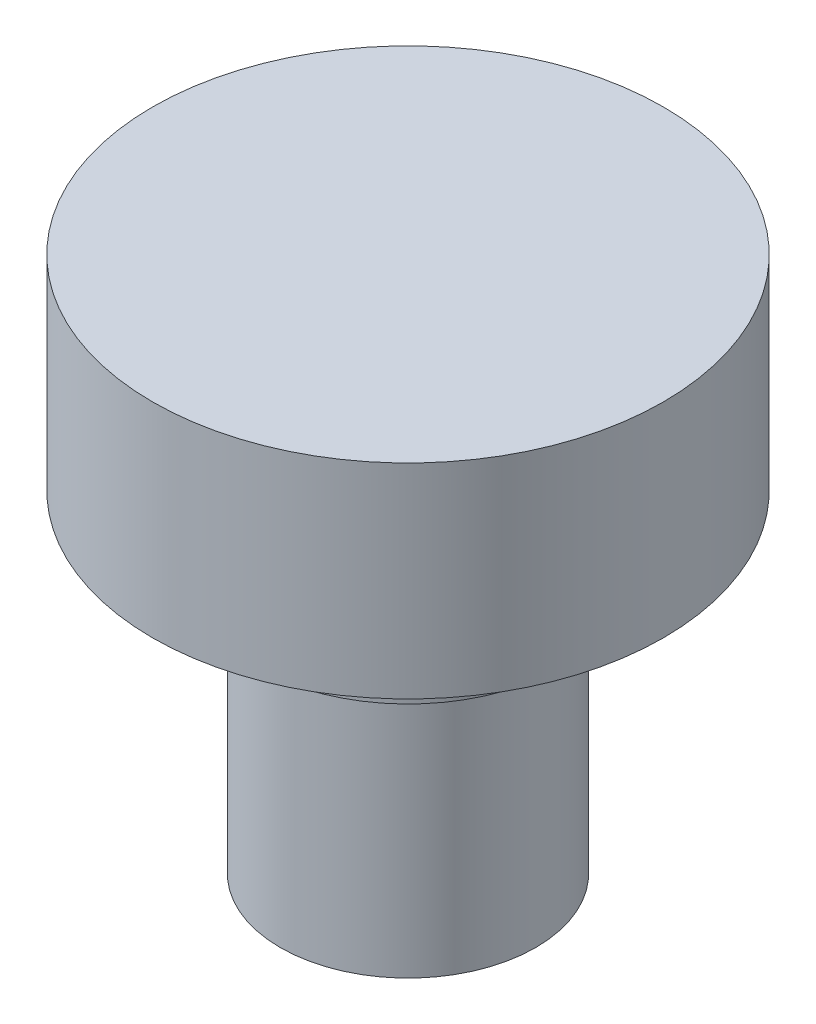
ISO-10303-21;
HEADER;
FILE_DESCRIPTION(('STEP AP214'),'2;1');
FILE_NAME('part.step','',(''),(''),'','','');
FILE_SCHEMA(('AUTOMOTIVE_DESIGN { 1 0 10303 214 1 1 1 1 }'));
ENDSEC;
DATA;
#1=APPLICATION_CONTEXT('core data for automotive mechanical design processes');
#2=APPLICATION_PROTOCOL_DEFINITION('international standard','automotive_design',2000,#1);
#3=PRODUCT_CONTEXT('',#1,'mechanical');
#4=PRODUCT('Part','Part','',(#3));
#5=PRODUCT_RELATED_PRODUCT_CATEGORY('part','',(#4));
#6=PRODUCT_DEFINITION_FORMATION('','',#4);
#7=PRODUCT_DEFINITION_CONTEXT('part definition',#1,'design');
#8=PRODUCT_DEFINITION('design','',#6,#7);
#9=PRODUCT_DEFINITION_SHAPE('','',#8);
#10=(LENGTH_UNIT() NAMED_UNIT(*) SI_UNIT(.MILLI.,.METRE.));
#11=(NAMED_UNIT(*) PLANE_ANGLE_UNIT() SI_UNIT($,.RADIAN.));
#12=(NAMED_UNIT(*) SI_UNIT($,.STERADIAN.) SOLID_ANGLE_UNIT());
#13=UNCERTAINTY_MEASURE_WITH_UNIT(LENGTH_MEASURE(1.E-05),#10,'distance_accuracy_value','');
#14=(GEOMETRIC_REPRESENTATION_CONTEXT(3) GLOBAL_UNCERTAINTY_ASSIGNED_CONTEXT((#13)) GLOBAL_UNIT_ASSIGNED_CONTEXT((#10,
#11,#12)) REPRESENTATION_CONTEXT('',''));
#15=CARTESIAN_POINT('',(0.,0.,0.));
#16=DIRECTION('',(0.,0.,1.));
#17=DIRECTION('',(1.,0.,0.));
#18=AXIS2_PLACEMENT_3D('',#15,#16,#17);
#19=CARTESIAN_POINT('',(0.,4.,0.));
#20=DIRECTION('',(0.,-1.,0.));
#21=DIRECTION('',(0.,0.,-1.));
#22=AXIS2_PLACEMENT_3D('',#19,#20,#21);
#23=CYLINDRICAL_SURFACE('',#22,5.);
#24=CARTESIAN_POINT('',(0.,4.,0.));
#25=DIRECTION('',(0.,1.,0.));
#26=DIRECTION('',(0.,0.,1.));
#27=AXIS2_PLACEMENT_3D('',#24,#25,#26);
#28=CIRCLE('',#27,5.);
#29=CARTESIAN_POINT('',(0.,4.,5.));
#30=VERTEX_POINT('',#29);
#31=EDGE_CURVE('E46',#30,#30,#28,.T.);
#32=ORIENTED_EDGE('',*,*,#31,.F.);
#33=EDGE_LOOP('',(#32));
#34=FACE_BOUND('',#33,.T.);
#35=CARTESIAN_POINT('',(0.,0.,0.));
#36=DIRECTION('',(0.,1.,0.));
#37=DIRECTION('',(0.,0.,1.));
#38=AXIS2_PLACEMENT_3D('',#35,#36,#37);
#39=CIRCLE('',#38,5.);
#40=CARTESIAN_POINT('',(0.,0.,5.));
#41=VERTEX_POINT('',#40);
#42=EDGE_CURVE('E75',#41,#41,#39,.T.);
#43=ORIENTED_EDGE('',*,*,#42,.T.);
#44=EDGE_LOOP('',(#43));
#45=FACE_BOUND('',#44,.T.);
#46=ADVANCED_FACE('F39',(#34,#45),#23,.T.);
#47=CARTESIAN_POINT('',(0.,4.,0.));
#48=DIRECTION('',(0.,1.,0.));
#49=DIRECTION('',(0.,0.,1.));
#50=AXIS2_PLACEMENT_3D('',#47,#48,#49);
#51=PLANE('',#50);
#52=ORIENTED_EDGE('',*,*,#31,.T.);
#53=EDGE_LOOP('',(#52));
#54=FACE_BOUND('',#53,.T.);
#55=ADVANCED_FACE('F103',(#54),#51,.T.);
#56=CARTESIAN_POINT('',(0.,0.,0.));
#57=DIRECTION('',(0.,1.,0.));
#58=DIRECTION('',(0.,0.,1.));
#59=AXIS2_PLACEMENT_3D('',#56,#57,#58);
#60=PLANE('',#59);
#61=CARTESIAN_POINT('',(0.,0.,0.));
#62=DIRECTION('',(0.,1.,0.));
#63=DIRECTION('',(0.,0.,1.));
#64=AXIS2_PLACEMENT_3D('',#61,#62,#63);
#65=CIRCLE('',#64,3.);
#66=CARTESIAN_POINT('',(0.,0.,3.));
#67=VERTEX_POINT('',#66);
#68=EDGE_CURVE('E11',#67,#67,#65,.F.);
#69=ORIENTED_EDGE('',*,*,#68,.F.);
#70=EDGE_LOOP('',(#69));
#71=FACE_BOUND('',#70,.T.);
#72=ORIENTED_EDGE('',*,*,#42,.F.);
#73=EDGE_LOOP('',(#72));
#74=FACE_BOUND('',#73,.T.);
#75=ADVANCED_FACE('F97',(#71,#74),#60,.F.);
#76=CARTESIAN_POINT('',(0.,-1.5,0.));
#77=DIRECTION('',(0.,1.,0.));
#78=DIRECTION('',(0.,0.,1.));
#79=AXIS2_PLACEMENT_3D('',#76,#77,#78);
#80=CYLINDRICAL_SURFACE('',#79,3.);
#81=CARTESIAN_POINT('',(0.,-1.5,0.));
#82=DIRECTION('',(0.,-1.,0.));
#83=DIRECTION('',(0.,0.,-1.));
#84=AXIS2_PLACEMENT_3D('',#81,#82,#83);
#85=CIRCLE('',#84,3.);
#86=CARTESIAN_POINT('',(0.,-1.5,-3.));
#87=VERTEX_POINT('',#86);
#88=EDGE_CURVE('E60',#87,#87,#85,.T.);
#89=ORIENTED_EDGE('',*,*,#88,.F.);
#90=EDGE_LOOP('',(#89));
#91=FACE_BOUND('',#90,.T.);
#92=ORIENTED_EDGE('',*,*,#68,.T.);
#93=EDGE_LOOP('',(#92));
#94=FACE_BOUND('',#93,.T.);
#95=ADVANCED_FACE('F91',(#91,#94),#80,.T.);
#96=CARTESIAN_POINT('',(0.,-1.5,0.));
#97=DIRECTION('',(0.,-1.,0.));
#98=DIRECTION('',(0.,0.,-1.));
#99=AXIS2_PLACEMENT_3D('',#96,#97,#98);
#100=PLANE('',#99);
#101=CARTESIAN_POINT('',(0.,-1.5,0.));
#102=DIRECTION('',(0.,-1.,0.));
#103=DIRECTION('',(0.,0.,-1.));
#104=AXIS2_PLACEMENT_3D('',#101,#102,#103);
#105=CIRCLE('',#104,2.5);
#106=CARTESIAN_POINT('',(0.,-1.5,2.5));
#107=VERTEX_POINT('',#106);
#108=EDGE_CURVE('E66',#107,#107,#105,.T.);
#109=ORIENTED_EDGE('',*,*,#108,.F.);
#110=EDGE_LOOP('',(#109));
#111=FACE_BOUND('',#110,.T.);
#112=ORIENTED_EDGE('',*,*,#88,.T.);
#113=EDGE_LOOP('',(#112));
#114=FACE_BOUND('',#113,.T.);
#115=ADVANCED_FACE('F87',(#111,#114),#100,.T.);
#116=CARTESIAN_POINT('',(0.,-6.5,0.));
#117=DIRECTION('',(0.,-1.,0.));
#118=DIRECTION('',(0.,0.,-1.));
#119=AXIS2_PLACEMENT_3D('',#116,#117,#118);
#120=PLANE('',#119);
#121=CARTESIAN_POINT('',(0.,-6.5,0.));
#122=DIRECTION('',(0.,-1.,0.));
#123=DIRECTION('',(0.,0.,-1.));
#124=AXIS2_PLACEMENT_3D('',#121,#122,#123);
#125=CIRCLE('',#124,1.25);
#126=CARTESIAN_POINT('',(0.,-6.5,-1.25));
#127=VERTEX_POINT('',#126);
#128=EDGE_CURVE('E61',#127,#127,#125,.T.);
#129=ORIENTED_EDGE('',*,*,#128,.F.);
#130=EDGE_LOOP('',(#129));
#131=FACE_BOUND('',#130,.T.);
#132=CARTESIAN_POINT('',(0.,-6.5,0.));
#133=DIRECTION('',(0.,-1.,0.));
#134=DIRECTION('',(0.,0.,-1.));
#135=AXIS2_PLACEMENT_3D('',#132,#133,#134);
#136=CIRCLE('',#135,2.5);
#137=CARTESIAN_POINT('',(0.,-6.5,2.5));
#138=VERTEX_POINT('',#137);
#139=EDGE_CURVE('E71',#138,#138,#136,.T.);
#140=ORIENTED_EDGE('',*,*,#139,.T.);
#141=EDGE_LOOP('',(#140));
#142=FACE_BOUND('',#141,.T.);
#143=ADVANCED_FACE('F90',(#131,#142),#120,.T.);
#144=CARTESIAN_POINT('',(0.,-6.5,0.));
#145=DIRECTION('',(0.,1.,0.));
#146=DIRECTION('',(0.,0.,1.));
#147=AXIS2_PLACEMENT_3D('',#144,#145,#146);
#148=CYLINDRICAL_SURFACE('',#147,2.5);
#149=CARTESIAN_POINT('',(0.,-1.5,2.5));
#150=CARTESIAN_POINT('',(0.,-1.55208333333333,2.5));
#151=CARTESIAN_POINT('',(0.,-1.60416666666667,2.5));
#152=CARTESIAN_POINT('',(0.,-1.70833333333333,2.5));
#153=CARTESIAN_POINT('',(0.,-1.76041666666667,2.5));
#154=CARTESIAN_POINT('',(0.,-1.86458333333333,2.5));
#155=CARTESIAN_POINT('',(0.,-1.91666666666667,2.5));
#156=CARTESIAN_POINT('',(0.,-2.02083333333333,2.5));
#157=CARTESIAN_POINT('',(0.,-2.07291666666667,2.5));
#158=CARTESIAN_POINT('',(0.,-2.17708333333333,2.5));
#159=CARTESIAN_POINT('',(0.,-2.22916666666667,2.5));
#160=CARTESIAN_POINT('',(0.,-2.33333333333333,2.5));
#161=CARTESIAN_POINT('',(0.,-2.38541666666667,2.5));
#162=CARTESIAN_POINT('',(0.,-2.48958333333333,2.5));
#163=CARTESIAN_POINT('',(0.,-2.54166666666667,2.5));
#164=CARTESIAN_POINT('',(0.,-2.64583333333333,2.5));
#165=CARTESIAN_POINT('',(0.,-2.69791666666667,2.5));
#166=CARTESIAN_POINT('',(0.,-2.80208333333333,2.5));
#167=CARTESIAN_POINT('',(0.,-2.85416666666667,2.5));
#168=CARTESIAN_POINT('',(0.,-2.95833333333333,2.5));
#169=CARTESIAN_POINT('',(0.,-3.01041666666667,2.5));
#170=CARTESIAN_POINT('',(0.,-3.11458333333333,2.5));
#171=CARTESIAN_POINT('',(0.,-3.16666666666667,2.5));
#172=CARTESIAN_POINT('',(0.,-3.27083333333333,2.5));
#173=CARTESIAN_POINT('',(0.,-3.32291666666667,2.5));
#174=CARTESIAN_POINT('',(0.,-3.42708333333333,2.5));
#175=CARTESIAN_POINT('',(0.,-3.47916666666667,2.5));
#176=CARTESIAN_POINT('',(0.,-3.58333333333333,2.5));
#177=CARTESIAN_POINT('',(0.,-3.63541666666667,2.5));
#178=CARTESIAN_POINT('',(0.,-3.73958333333333,2.5));
#179=CARTESIAN_POINT('',(0.,-3.79166666666667,2.5));
#180=CARTESIAN_POINT('',(0.,-3.89583333333333,2.5));
#181=CARTESIAN_POINT('',(0.,-3.94791666666667,2.5));
#182=CARTESIAN_POINT('',(0.,-4.05208333333333,2.5));
#183=CARTESIAN_POINT('',(0.,-4.10416666666667,2.5));
#184=CARTESIAN_POINT('',(0.,-4.20833333333333,2.5));
#185=CARTESIAN_POINT('',(0.,-4.26041666666667,2.5));
#186=CARTESIAN_POINT('',(0.,-4.36458333333333,2.5));
#187=CARTESIAN_POINT('',(0.,-4.41666666666667,2.5));
#188=CARTESIAN_POINT('',(0.,-4.52083333333333,2.5));
#189=CARTESIAN_POINT('',(0.,-4.57291666666667,2.5));
#190=CARTESIAN_POINT('',(0.,-4.67708333333333,2.5));
#191=CARTESIAN_POINT('',(0.,-4.72916666666667,2.5));
#192=CARTESIAN_POINT('',(0.,-4.83333333333333,2.5));
#193=CARTESIAN_POINT('',(0.,-4.88541666666667,2.5));
#194=CARTESIAN_POINT('',(0.,-4.98958333333333,2.5));
#195=CARTESIAN_POINT('',(0.,-5.04166666666667,2.5));
#196=CARTESIAN_POINT('',(0.,-5.14583333333333,2.5));
#197=CARTESIAN_POINT('',(0.,-5.19791666666667,2.5));
#198=CARTESIAN_POINT('',(0.,-5.30208333333333,2.5));
#199=CARTESIAN_POINT('',(0.,-5.35416666666667,2.5));
#200=CARTESIAN_POINT('',(0.,-5.45833333333333,2.5));
#201=CARTESIAN_POINT('',(0.,-5.51041666666667,2.5));
#202=CARTESIAN_POINT('',(0.,-5.61458333333333,2.5));
#203=CARTESIAN_POINT('',(0.,-5.66666666666667,2.5));
#204=CARTESIAN_POINT('',(0.,-5.77083333333333,2.5));
#205=CARTESIAN_POINT('',(0.,-5.82291666666667,2.5));
#206=CARTESIAN_POINT('',(0.,-5.92708333333333,2.5));
#207=CARTESIAN_POINT('',(0.,-5.97916666666667,2.5));
#208=CARTESIAN_POINT('',(0.,-6.08333333333333,2.5));
#209=CARTESIAN_POINT('',(0.,-6.13541666666667,2.5));
#210=CARTESIAN_POINT('',(0.,-6.23958333333333,2.5));
#211=CARTESIAN_POINT('',(0.,-6.29166666666667,2.5));
#212=CARTESIAN_POINT('',(0.,-6.39583333333333,2.5));
#213=CARTESIAN_POINT('',(0.,-6.44791666666667,2.5));
#214=CARTESIAN_POINT('',(0.,-6.5,2.5));
#215=B_SPLINE_CURVE_WITH_KNOTS('',3,(#149,#150,#151,#152,#153,#154,#155,#156,#157,#158,#159,
#160,#161,#162,#163,#164,#165,#166,#167,#168,#169,#170,#171,#172,#173,#174,#175,#176,#177,#178,
#179,#180,#181,#182,#183,#184,#185,#186,#187,#188,#189,#190,#191,#192,#193,#194,#195,#196,#197,
#198,#199,#200,#201,#202,#203,#204,#205,#206,#207,#208,#209,#210,#211,#212,#213,#214),
.UNSPECIFIED.,.F.,.F.,(4,2,2,2,2,2,2,2,2,2,2,2,2,2,2,2,2,2,2,2,2,2,2,2,2,2,2,2,2,2,2,2,4),(0.,
0.15625,0.3125,0.46875,0.625000000000001,0.78125,0.9375,1.09375,1.25,1.40625,1.5625,1.71875,
1.875,2.03125,2.1875,2.34375,2.5,2.65625,2.8125,2.96875,3.125,3.28125,3.4375,3.59375,3.75,
3.90625,4.0625,4.21875,4.375,4.53125,4.6875,4.84375,5.),.UNSPECIFIED.);
#216=EDGE_CURVE('BSEAM53',#107,#138,#215,.T.);
#217=ORIENTED_EDGE('',*,*,#108,.T.);
#218=ORIENTED_EDGE('',*,*,#139,.F.);
#219=ORIENTED_EDGE('',*,*,#216,.T.);
#220=ORIENTED_EDGE('',*,*,#216,.F.);
#221=EDGE_LOOP('',(#217,#219,#218,#220));
#222=FACE_BOUND('',#221,.T.);
#223=ADVANCED_FACE('F53',(#222),#148,.T.);
#224=CARTESIAN_POINT('',(0.,1.5,0.));
#225=DIRECTION('',(0.,-1.,0.));
#226=DIRECTION('',(0.,0.,-1.));
#227=AXIS2_PLACEMENT_3D('',#224,#225,#226);
#228=CONICAL_SURFACE('',#227,1.25,1.02974425867665);
#229=CARTESIAN_POINT('',(0.,2.25107577378445,0.));
#230=VERTEX_POINT('',#229);
#231=VERTEX_LOOP('',#230);
#232=FACE_BOUND('',#231,.T.);
#233=CARTESIAN_POINT('',(0.,1.5,0.));
#234=DIRECTION('',(0.,-1.,0.));
#235=DIRECTION('',(0.,0.,-1.));
#236=AXIS2_PLACEMENT_3D('',#233,#234,#235);
#237=CIRCLE('',#236,1.25);
#238=CARTESIAN_POINT('',(0.,1.5,-1.25));
#239=VERTEX_POINT('',#238);
#240=EDGE_CURVE('E57',#239,#239,#237,.T.);
#241=ORIENTED_EDGE('',*,*,#240,.T.);
#242=EDGE_LOOP('',(#241));
#243=FACE_BOUND('',#242,.T.);
#244=ADVANCED_FACE('F49',(#232,#243),#228,.F.);
#245=CARTESIAN_POINT('',(0.,-6.5,0.));
#246=DIRECTION('',(0.,-1.,0.));
#247=DIRECTION('',(0.,0.,-1.));
#248=AXIS2_PLACEMENT_3D('',#245,#246,#247);
#249=CYLINDRICAL_SURFACE('',#248,1.25);
#250=ORIENTED_EDGE('',*,*,#240,.F.);
#251=EDGE_LOOP('',(#250));
#252=FACE_BOUND('',#251,.T.);
#253=ORIENTED_EDGE('',*,*,#128,.T.);
#254=EDGE_LOOP('',(#253));
#255=FACE_BOUND('',#254,.T.);
#256=ADVANCED_FACE('F52',(#252,#255),#249,.F.);
#257=CLOSED_SHELL('',(#46,#55,#75,#95,#115,#143,#223,#244,#256));
#258=MANIFOLD_SOLID_BREP('B2',#257);
#259=ADVANCED_BREP_SHAPE_REPRESENTATION('',(#18,#258),#14);
#260=SHAPE_DEFINITION_REPRESENTATION(#9,#259);
ENDSEC;
END-ISO-10303-21;
